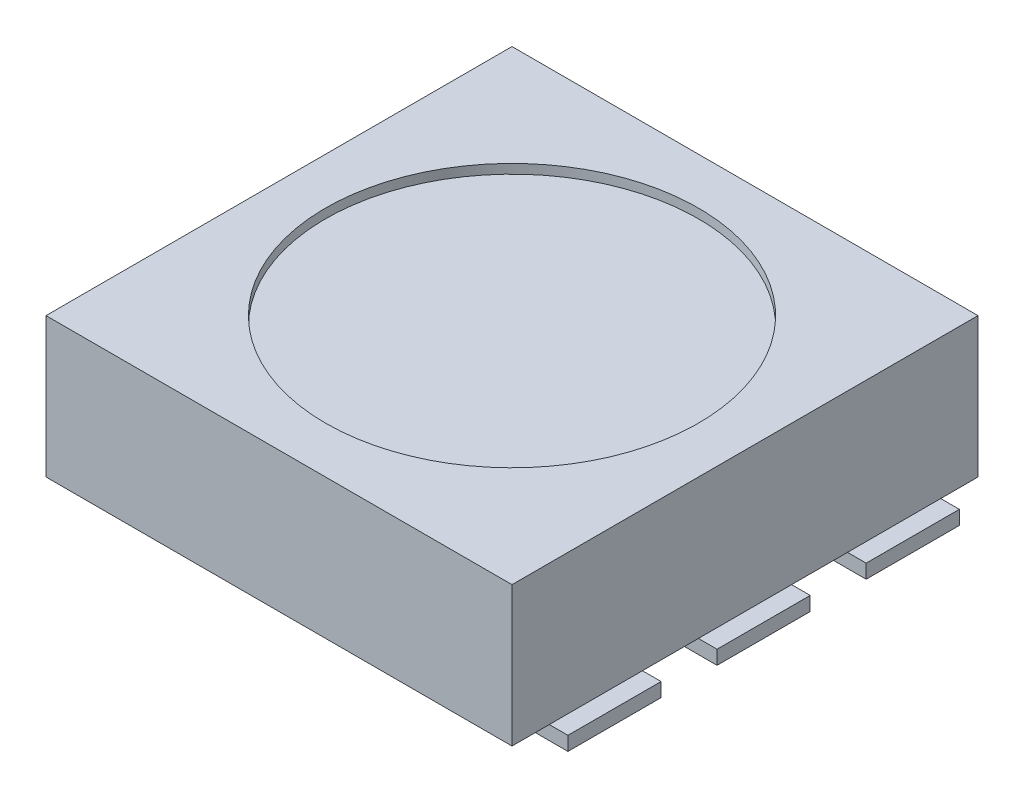
ISO-10303-21;
HEADER;
FILE_DESCRIPTION(('STEP AP214'),'2;1');
FILE_NAME('part.step','',(''),(''),'','','');
FILE_SCHEMA(('AUTOMOTIVE_DESIGN { 1 0 10303 214 1 1 1 1 }'));
ENDSEC;
DATA;
#1=APPLICATION_CONTEXT('core data for automotive mechanical design processes');
#2=APPLICATION_PROTOCOL_DEFINITION('international standard','automotive_design',2000,#1);
#3=PRODUCT_CONTEXT('',#1,'mechanical');
#4=PRODUCT('Part','Part','',(#3));
#5=PRODUCT_RELATED_PRODUCT_CATEGORY('part','',(#4));
#6=PRODUCT_DEFINITION_FORMATION('','',#4);
#7=PRODUCT_DEFINITION_CONTEXT('part definition',#1,'design');
#8=PRODUCT_DEFINITION('design','',#6,#7);
#9=PRODUCT_DEFINITION_SHAPE('','',#8);
#10=(LENGTH_UNIT() NAMED_UNIT(*) SI_UNIT(.MILLI.,.METRE.));
#11=(NAMED_UNIT(*) PLANE_ANGLE_UNIT() SI_UNIT($,.RADIAN.));
#12=(NAMED_UNIT(*) SI_UNIT($,.STERADIAN.) SOLID_ANGLE_UNIT());
#13=UNCERTAINTY_MEASURE_WITH_UNIT(LENGTH_MEASURE(1.E-05),#10,'distance_accuracy_value','');
#14=(GEOMETRIC_REPRESENTATION_CONTEXT(3) GLOBAL_UNCERTAINTY_ASSIGNED_CONTEXT((#13)) GLOBAL_UNIT_ASSIGNED_CONTEXT((#10,
#11,#12)) REPRESENTATION_CONTEXT('',''));
#15=CARTESIAN_POINT('',(0.,0.,0.));
#16=DIRECTION('',(0.,0.,1.));
#17=DIRECTION('',(1.,0.,0.));
#18=AXIS2_PLACEMENT_3D('',#15,#16,#17);
#19=CARTESIAN_POINT('',(-2.5,1.5,-2.5));
#20=DIRECTION('',(1.,0.,0.));
#21=DIRECTION('',(0.,0.,-1.));
#22=AXIS2_PLACEMENT_3D('',#19,#20,#21);
#23=PLANE('',#22);
#24=DIRECTION('',(0.,0.,1.));
#25=VECTOR('',#24,1.);
#26=CARTESIAN_POINT('',(-2.5,0.,-2.5));
#27=LINE('',#26,#25);
#28=CARTESIAN_POINT('',(-2.5,0.,-2.5));
#29=VERTEX_POINT('',#28);
#30=CARTESIAN_POINT('',(-2.5,0.,-2.1));
#31=VERTEX_POINT('',#30);
#32=EDGE_CURVE('E546',#29,#31,#27,.T.);
#33=ORIENTED_EDGE('',*,*,#32,.T.);
#34=CARTESIAN_POINT('',(-2.5,0.,-1.1));
#35=VERTEX_POINT('',#34);
#36=EDGE_CURVE('E551',#31,#35,#27,.T.);
#37=ORIENTED_EDGE('',*,*,#36,.T.);
#38=CARTESIAN_POINT('',(-2.5,0.,-0.5));
#39=VERTEX_POINT('',#38);
#40=EDGE_CURVE('E552',#35,#39,#27,.T.);
#41=ORIENTED_EDGE('',*,*,#40,.T.);
#42=CARTESIAN_POINT('',(-2.5,0.,0.5));
#43=VERTEX_POINT('',#42);
#44=EDGE_CURVE('E620',#39,#43,#27,.T.);
#45=ORIENTED_EDGE('',*,*,#44,.T.);
#46=CARTESIAN_POINT('',(-2.5,0.,1.1));
#47=VERTEX_POINT('',#46);
#48=EDGE_CURVE('E618',#43,#47,#27,.T.);
#49=ORIENTED_EDGE('',*,*,#48,.T.);
#50=CARTESIAN_POINT('',(-2.5,0.,2.1));
#51=VERTEX_POINT('',#50);
#52=EDGE_CURVE('E553',#47,#51,#27,.T.);
#53=ORIENTED_EDGE('',*,*,#52,.T.);
#54=CARTESIAN_POINT('',(-2.5,0.,2.5));
#55=VERTEX_POINT('',#54);
#56=EDGE_CURVE('E517',#51,#55,#27,.T.);
#57=ORIENTED_EDGE('',*,*,#56,.T.);
#58=DIRECTION('',(0.,-1.,0.));
#59=VECTOR('',#58,1.);
#60=CARTESIAN_POINT('',(-2.5,1.5,2.5));
#61=LINE('',#60,#59);
#62=CARTESIAN_POINT('',(-2.5,1.5,2.5));
#63=VERTEX_POINT('',#62);
#64=EDGE_CURVE('E576',#63,#55,#61,.T.);
#65=ORIENTED_EDGE('',*,*,#64,.F.);
#66=DIRECTION('',(0.,0.,1.));
#67=VECTOR('',#66,1.);
#68=CARTESIAN_POINT('',(-2.5,1.5,-2.5));
#69=LINE('',#68,#67);
#70=CARTESIAN_POINT('',(-2.5,1.5,-2.5));
#71=VERTEX_POINT('',#70);
#72=EDGE_CURVE('E529',#71,#63,#69,.T.);
#73=ORIENTED_EDGE('',*,*,#72,.F.);
#74=DIRECTION('',(0.,-1.,0.));
#75=VECTOR('',#74,1.);
#76=CARTESIAN_POINT('',(-2.5,1.5,-2.5));
#77=LINE('',#76,#75);
#78=EDGE_CURVE('E545',#71,#29,#77,.T.);
#79=ORIENTED_EDGE('',*,*,#78,.T.);
#80=EDGE_LOOP('',(#33,#37,#41,#45,#49,#53,#57,#65,#73,#79));
#81=FACE_BOUND('',#80,.T.);
#82=ADVANCED_FACE('F39',(#81),#23,.F.);
#83=CARTESIAN_POINT('',(-2.5,1.5,2.5));
#84=DIRECTION('',(0.,0.,-1.));
#85=DIRECTION('',(-1.,0.,0.));
#86=AXIS2_PLACEMENT_3D('',#83,#84,#85);
#87=PLANE('',#86);
#88=DIRECTION('',(1.,0.,0.));
#89=VECTOR('',#88,1.);
#90=CARTESIAN_POINT('',(-2.5,0.,2.5));
#91=LINE('',#90,#89);
#92=CARTESIAN_POINT('',(2.5,0.,2.5));
#93=VERTEX_POINT('',#92);
#94=EDGE_CURVE('E550',#55,#93,#91,.T.);
#95=ORIENTED_EDGE('',*,*,#94,.T.);
#96=DIRECTION('',(0.,-1.,0.));
#97=VECTOR('',#96,1.);
#98=CARTESIAN_POINT('',(2.5,1.5,2.5));
#99=LINE('',#98,#97);
#100=CARTESIAN_POINT('',(2.5,1.5,2.5));
#101=VERTEX_POINT('',#100);
#102=EDGE_CURVE('E572',#101,#93,#99,.T.);
#103=ORIENTED_EDGE('',*,*,#102,.F.);
#104=DIRECTION('',(1.,0.,0.));
#105=VECTOR('',#104,1.);
#106=CARTESIAN_POINT('',(-2.5,1.5,2.5));
#107=LINE('',#106,#105);
#108=EDGE_CURVE('E533',#63,#101,#107,.T.);
#109=ORIENTED_EDGE('',*,*,#108,.F.);
#110=ORIENTED_EDGE('',*,*,#64,.T.);
#111=EDGE_LOOP('',(#95,#103,#109,#110));
#112=FACE_BOUND('',#111,.T.);
#113=ADVANCED_FACE('F637',(#112),#87,.F.);
#114=CARTESIAN_POINT('',(2.5,1.5,-2.5));
#115=DIRECTION('',(1.,0.,0.));
#116=DIRECTION('',(0.,0.,-1.));
#117=AXIS2_PLACEMENT_3D('',#114,#115,#116);
#118=PLANE('',#117);
#119=DIRECTION('',(0.,0.,1.));
#120=VECTOR('',#119,1.);
#121=CARTESIAN_POINT('',(2.5,0.,-2.5));
#122=LINE('',#121,#120);
#123=CARTESIAN_POINT('',(2.5,0.,-2.5));
#124=VERTEX_POINT('',#123);
#125=CARTESIAN_POINT('',(2.5,0.,-2.1));
#126=VERTEX_POINT('',#125);
#127=EDGE_CURVE('E558',#124,#126,#122,.T.);
#128=ORIENTED_EDGE('',*,*,#127,.F.);
#129=DIRECTION('',(0.,-1.,0.));
#130=VECTOR('',#129,1.);
#131=CARTESIAN_POINT('',(2.5,1.5,-2.5));
#132=LINE('',#131,#130);
#133=CARTESIAN_POINT('',(2.5,1.5,-2.5));
#134=VERTEX_POINT('',#133);
#135=EDGE_CURVE('E569',#134,#124,#132,.T.);
#136=ORIENTED_EDGE('',*,*,#135,.F.);
#137=DIRECTION('',(0.,0.,1.));
#138=VECTOR('',#137,1.);
#139=CARTESIAN_POINT('',(2.5,1.5,-2.5));
#140=LINE('',#139,#138);
#141=EDGE_CURVE('E537',#134,#101,#140,.T.);
#142=ORIENTED_EDGE('',*,*,#141,.T.);
#143=ORIENTED_EDGE('',*,*,#102,.T.);
#144=CARTESIAN_POINT('',(2.5,0.,2.1));
#145=VERTEX_POINT('',#144);
#146=EDGE_CURVE('E557',#145,#93,#122,.T.);
#147=ORIENTED_EDGE('',*,*,#146,.F.);
#148=CARTESIAN_POINT('',(2.5,0.,1.1));
#149=VERTEX_POINT('',#148);
#150=EDGE_CURVE('E563',#149,#145,#122,.T.);
#151=ORIENTED_EDGE('',*,*,#150,.F.);
#152=CARTESIAN_POINT('',(2.5,0.,0.5));
#153=VERTEX_POINT('',#152);
#154=EDGE_CURVE('E652',#153,#149,#122,.T.);
#155=ORIENTED_EDGE('',*,*,#154,.F.);
#156=CARTESIAN_POINT('',(2.5,0.,-0.5));
#157=VERTEX_POINT('',#156);
#158=EDGE_CURVE('E654',#157,#153,#122,.T.);
#159=ORIENTED_EDGE('',*,*,#158,.F.);
#160=CARTESIAN_POINT('',(2.5,0.,-1.1));
#161=VERTEX_POINT('',#160);
#162=EDGE_CURVE('E562',#161,#157,#122,.T.);
#163=ORIENTED_EDGE('',*,*,#162,.F.);
#164=EDGE_CURVE('E561',#126,#161,#122,.T.);
#165=ORIENTED_EDGE('',*,*,#164,.F.);
#166=EDGE_LOOP('',(#128,#136,#142,#143,#147,#151,#155,#159,#163,#165));
#167=FACE_BOUND('',#166,.T.);
#168=ADVANCED_FACE('F648',(#167),#118,.T.);
#169=CARTESIAN_POINT('',(-2.5,1.5,-2.5));
#170=DIRECTION('',(0.,0.,-1.));
#171=DIRECTION('',(-1.,0.,0.));
#172=AXIS2_PLACEMENT_3D('',#169,#170,#171);
#173=PLANE('',#172);
#174=DIRECTION('',(1.,0.,0.));
#175=VECTOR('',#174,1.);
#176=CARTESIAN_POINT('',(-2.5,0.,-2.5));
#177=LINE('',#176,#175);
#178=EDGE_CURVE('E534',#29,#124,#177,.T.);
#179=ORIENTED_EDGE('',*,*,#178,.F.);
#180=ORIENTED_EDGE('',*,*,#78,.F.);
#181=DIRECTION('',(1.,0.,0.));
#182=VECTOR('',#181,1.);
#183=CARTESIAN_POINT('',(-2.5,1.5,-2.5));
#184=LINE('',#183,#182);
#185=EDGE_CURVE('E541',#71,#134,#184,.T.);
#186=ORIENTED_EDGE('',*,*,#185,.T.);
#187=ORIENTED_EDGE('',*,*,#135,.T.);
#188=EDGE_LOOP('',(#179,#180,#186,#187));
#189=FACE_BOUND('',#188,.T.);
#190=ADVANCED_FACE('F644',(#189),#173,.T.);
#191=CARTESIAN_POINT('',(0.,1.5,0.));
#192=DIRECTION('',(0.,1.,0.));
#193=DIRECTION('',(0.,0.,1.));
#194=AXIS2_PLACEMENT_3D('',#191,#192,#193);
#195=PLANE('',#194);
#196=CARTESIAN_POINT('',(0.,1.5,0.));
#197=DIRECTION('',(0.,1.,0.));
#198=DIRECTION('',(0.,0.,1.));
#199=AXIS2_PLACEMENT_3D('',#196,#197,#198);
#200=CIRCLE('',#199,2.);
#201=CARTESIAN_POINT('',(0.,1.5,2.));
#202=VERTEX_POINT('',#201);
#203=EDGE_CURVE('E706',#202,#202,#200,.T.);
#204=ORIENTED_EDGE('',*,*,#203,.F.);
#205=EDGE_LOOP('',(#204));
#206=FACE_BOUND('',#205,.T.);
#207=ORIENTED_EDGE('',*,*,#72,.T.);
#208=ORIENTED_EDGE('',*,*,#108,.T.);
#209=ORIENTED_EDGE('',*,*,#141,.F.);
#210=ORIENTED_EDGE('',*,*,#185,.F.);
#211=EDGE_LOOP('',(#207,#208,#209,#210));
#212=FACE_BOUND('',#211,.T.);
#213=ADVANCED_FACE('F641',(#206,#212),#195,.T.);
#214=CARTESIAN_POINT('',(0.,0.,0.));
#215=DIRECTION('',(0.,1.,0.));
#216=DIRECTION('',(0.,0.,1.));
#217=AXIS2_PLACEMENT_3D('',#214,#215,#216);
#218=PLANE('',#217);
#219=DIRECTION('',(0.,0.,-1.));
#220=VECTOR('',#219,1.);
#221=CARTESIAN_POINT('',(1.7,0.,-1.1));
#222=LINE('',#221,#220);
#223=CARTESIAN_POINT('',(1.7,0.,-1.1));
#224=VERTEX_POINT('',#223);
#225=CARTESIAN_POINT('',(1.7,0.,-2.1));
#226=VERTEX_POINT('',#225);
#227=EDGE_CURVE('E54',#224,#226,#222,.T.);
#228=ORIENTED_EDGE('',*,*,#227,.F.);
#229=DIRECTION('',(1.,0.,0.));
#230=VECTOR('',#229,1.);
#231=CARTESIAN_POINT('',(1.7,0.,-1.1));
#232=LINE('',#231,#230);
#233=EDGE_CURVE('E288',#224,#161,#232,.T.);
#234=ORIENTED_EDGE('',*,*,#233,.T.);
#235=ORIENTED_EDGE('',*,*,#162,.T.);
#236=DIRECTION('',(1.,0.,0.));
#237=VECTOR('',#236,1.);
#238=CARTESIAN_POINT('',(1.7,0.,-0.5));
#239=LINE('',#238,#237);
#240=CARTESIAN_POINT('',(1.7,0.,-0.5));
#241=VERTEX_POINT('',#240);
#242=EDGE_CURVE('E328',#241,#157,#239,.T.);
#243=ORIENTED_EDGE('',*,*,#242,.F.);
#244=DIRECTION('',(0.,0.,-1.));
#245=VECTOR('',#244,1.);
#246=CARTESIAN_POINT('',(1.7,0.,0.5));
#247=LINE('',#246,#245);
#248=CARTESIAN_POINT('',(1.7,0.,0.5));
#249=VERTEX_POINT('',#248);
#250=EDGE_CURVE('E322',#249,#241,#247,.T.);
#251=ORIENTED_EDGE('',*,*,#250,.F.);
#252=DIRECTION('',(1.,0.,0.));
#253=VECTOR('',#252,1.);
#254=CARTESIAN_POINT('',(1.7,0.,0.5));
#255=LINE('',#254,#253);
#256=EDGE_CURVE('E337',#249,#153,#255,.T.);
#257=ORIENTED_EDGE('',*,*,#256,.T.);
#258=ORIENTED_EDGE('',*,*,#154,.T.);
#259=DIRECTION('',(1.,0.,0.));
#260=VECTOR('',#259,1.);
#261=CARTESIAN_POINT('',(1.7,0.,1.1));
#262=LINE('',#261,#260);
#263=CARTESIAN_POINT('',(1.7,0.,1.1));
#264=VERTEX_POINT('',#263);
#265=EDGE_CURVE('E375',#264,#149,#262,.T.);
#266=ORIENTED_EDGE('',*,*,#265,.F.);
#267=DIRECTION('',(0.,0.,-1.));
#268=VECTOR('',#267,1.);
#269=CARTESIAN_POINT('',(1.7,0.,2.1));
#270=LINE('',#269,#268);
#271=CARTESIAN_POINT('',(1.7,0.,2.1));
#272=VERTEX_POINT('',#271);
#273=EDGE_CURVE('E369',#272,#264,#270,.T.);
#274=ORIENTED_EDGE('',*,*,#273,.F.);
#275=DIRECTION('',(1.,0.,0.));
#276=VECTOR('',#275,1.);
#277=CARTESIAN_POINT('',(1.7,0.,2.1));
#278=LINE('',#277,#276);
#279=EDGE_CURVE('E384',#272,#145,#278,.T.);
#280=ORIENTED_EDGE('',*,*,#279,.T.);
#281=ORIENTED_EDGE('',*,*,#146,.T.);
#282=ORIENTED_EDGE('',*,*,#94,.F.);
#283=ORIENTED_EDGE('',*,*,#56,.F.);
#284=DIRECTION('',(1.,0.,0.));
#285=VECTOR('',#284,1.);
#286=CARTESIAN_POINT('',(-2.7,0.,2.1));
#287=LINE('',#286,#285);
#288=CARTESIAN_POINT('',(-1.7,0.,2.1));
#289=VERTEX_POINT('',#288);
#290=EDGE_CURVE('E504',#51,#289,#287,.T.);
#291=ORIENTED_EDGE('',*,*,#290,.T.);
#292=DIRECTION('',(0.,0.,-1.));
#293=VECTOR('',#292,1.);
#294=CARTESIAN_POINT('',(-1.7,0.,2.1));
#295=LINE('',#294,#293);
#296=CARTESIAN_POINT('',(-1.7,0.,1.1));
#297=VERTEX_POINT('',#296);
#298=EDGE_CURVE('E503',#289,#297,#295,.T.);
#299=ORIENTED_EDGE('',*,*,#298,.T.);
#300=DIRECTION('',(1.,0.,0.));
#301=VECTOR('',#300,1.);
#302=CARTESIAN_POINT('',(-2.7,0.,1.1));
#303=LINE('',#302,#301);
#304=EDGE_CURVE('E511',#47,#297,#303,.T.);
#305=ORIENTED_EDGE('',*,*,#304,.F.);
#306=ORIENTED_EDGE('',*,*,#48,.F.);
#307=DIRECTION('',(1.,0.,0.));
#308=VECTOR('',#307,1.);
#309=CARTESIAN_POINT('',(0.,0.,0.5));
#310=LINE('',#309,#308);
#311=CARTESIAN_POINT('',(-1.7,0.,0.5));
#312=VERTEX_POINT('',#311);
#313=EDGE_CURVE('E584',#43,#312,#310,.T.);
#314=ORIENTED_EDGE('',*,*,#313,.T.);
#315=DIRECTION('',(0.,0.,-1.));
#316=VECTOR('',#315,1.);
#317=CARTESIAN_POINT('',(-1.7,0.,0.5));
#318=LINE('',#317,#316);
#319=CARTESIAN_POINT('',(-1.7,0.,-0.5));
#320=VERTEX_POINT('',#319);
#321=EDGE_CURVE('E463',#312,#320,#318,.T.);
#322=ORIENTED_EDGE('',*,*,#321,.T.);
#323=DIRECTION('',(1.,0.,0.));
#324=VECTOR('',#323,1.);
#325=CARTESIAN_POINT('',(0.,0.,-0.5));
#326=LINE('',#325,#324);
#327=EDGE_CURVE('E580',#39,#320,#326,.T.);
#328=ORIENTED_EDGE('',*,*,#327,.F.);
#329=ORIENTED_EDGE('',*,*,#40,.F.);
#330=DIRECTION('',(1.,0.,0.));
#331=VECTOR('',#330,1.);
#332=CARTESIAN_POINT('',(0.,0.,-1.1));
#333=LINE('',#332,#331);
#334=CARTESIAN_POINT('',(-1.7,0.,-1.1));
#335=VERTEX_POINT('',#334);
#336=EDGE_CURVE('E11',#35,#335,#333,.T.);
#337=ORIENTED_EDGE('',*,*,#336,.T.);
#338=DIRECTION('',(0.,0.,-1.));
#339=VECTOR('',#338,1.);
#340=CARTESIAN_POINT('',(-1.7,0.,-1.1));
#341=LINE('',#340,#339);
#342=CARTESIAN_POINT('',(-1.7,0.,-2.1));
#343=VERTEX_POINT('',#342);
#344=EDGE_CURVE('E421',#335,#343,#341,.T.);
#345=ORIENTED_EDGE('',*,*,#344,.T.);
#346=DIRECTION('',(1.,0.,0.));
#347=VECTOR('',#346,1.);
#348=CARTESIAN_POINT('',(0.,0.,-2.1));
#349=LINE('',#348,#347);
#350=EDGE_CURVE('E47',#31,#343,#349,.T.);
#351=ORIENTED_EDGE('',*,*,#350,.F.);
#352=ORIENTED_EDGE('',*,*,#32,.F.);
#353=ORIENTED_EDGE('',*,*,#178,.T.);
#354=ORIENTED_EDGE('',*,*,#127,.T.);
#355=DIRECTION('',(1.,0.,0.));
#356=VECTOR('',#355,1.);
#357=CARTESIAN_POINT('',(1.7,0.,-2.1));
#358=LINE('',#357,#356);
#359=EDGE_CURVE('E59',#226,#126,#358,.T.);
#360=ORIENTED_EDGE('',*,*,#359,.F.);
#361=EDGE_LOOP('',(#228,#234,#235,#243,#251,#257,#258,#266,#274,#280,#281,#282,#283,#291,#299,
#305,#306,#314,#322,#328,#329,#337,#345,#351,#352,#353,#354,#360));
#362=FACE_BOUND('',#361,.T.);
#363=ADVANCED_FACE('F597',(#362),#218,.F.);
#364=CARTESIAN_POINT('',(0.,0.,0.));
#365=DIRECTION('',(0.,1.,0.));
#366=DIRECTION('',(0.,0.,1.));
#367=AXIS2_PLACEMENT_3D('',#364,#365,#366);
#368=PLANE('',#367);
#369=ORIENTED_EDGE('',*,*,#52,.F.);
#370=CARTESIAN_POINT('',(-2.7,0.,1.1));
#371=VERTEX_POINT('',#370);
#372=EDGE_CURVE('E507',#371,#47,#303,.T.);
#373=ORIENTED_EDGE('',*,*,#372,.F.);
#374=DIRECTION('',(0.,0.,-1.));
#375=VECTOR('',#374,1.);
#376=CARTESIAN_POINT('',(-2.7,0.,2.1));
#377=LINE('',#376,#375);
#378=CARTESIAN_POINT('',(-2.7,0.,2.1));
#379=VERTEX_POINT('',#378);
#380=EDGE_CURVE('E489',#379,#371,#377,.T.);
#381=ORIENTED_EDGE('',*,*,#380,.F.);
#382=EDGE_CURVE('E471',#379,#51,#287,.T.);
#383=ORIENTED_EDGE('',*,*,#382,.T.);
#384=EDGE_LOOP('',(#369,#373,#381,#383));
#385=FACE_BOUND('',#384,.T.);
#386=ADVANCED_FACE('F742',(#385),#368,.T.);
#387=CARTESIAN_POINT('',(-2.7,-0.15,2.1));
#388=DIRECTION('',(0.,0.,1.));
#389=DIRECTION('',(1.,0.,0.));
#390=AXIS2_PLACEMENT_3D('',#387,#388,#389);
#391=PLANE('',#390);
#392=ORIENTED_EDGE('',*,*,#382,.F.);
#393=DIRECTION('',(0.,1.,0.));
#394=VECTOR('',#393,1.);
#395=CARTESIAN_POINT('',(-2.7,-0.15,2.1));
#396=LINE('',#395,#394);
#397=CARTESIAN_POINT('',(-2.7,-0.15,2.1));
#398=VERTEX_POINT('',#397);
#399=EDGE_CURVE('E514',#398,#379,#396,.T.);
#400=ORIENTED_EDGE('',*,*,#399,.F.);
#401=DIRECTION('',(1.,0.,0.));
#402=VECTOR('',#401,1.);
#403=CARTESIAN_POINT('',(-2.7,-0.15,2.1));
#404=LINE('',#403,#402);
#405=CARTESIAN_POINT('',(-1.7,-0.15,2.1));
#406=VERTEX_POINT('',#405);
#407=EDGE_CURVE('E484',#398,#406,#404,.T.);
#408=ORIENTED_EDGE('',*,*,#407,.T.);
#409=DIRECTION('',(0.,1.,0.));
#410=VECTOR('',#409,1.);
#411=CARTESIAN_POINT('',(-1.7,-0.15,2.1));
#412=LINE('',#411,#410);
#413=EDGE_CURVE('E499',#406,#289,#412,.T.);
#414=ORIENTED_EDGE('',*,*,#413,.T.);
#415=ORIENTED_EDGE('',*,*,#290,.F.);
#416=EDGE_LOOP('',(#392,#400,#408,#414,#415));
#417=FACE_BOUND('',#416,.T.);
#418=ADVANCED_FACE('F746',(#417),#391,.T.);
#419=CARTESIAN_POINT('',(-2.7,-0.15,2.1));
#420=DIRECTION('',(1.,0.,0.));
#421=DIRECTION('',(0.,0.,-1.));
#422=AXIS2_PLACEMENT_3D('',#419,#420,#421);
#423=PLANE('',#422);
#424=ORIENTED_EDGE('',*,*,#380,.T.);
#425=DIRECTION('',(0.,1.,0.));
#426=VECTOR('',#425,1.);
#427=CARTESIAN_POINT('',(-2.7,-0.15,1.1));
#428=LINE('',#427,#426);
#429=CARTESIAN_POINT('',(-2.7,-0.15,1.1));
#430=VERTEX_POINT('',#429);
#431=EDGE_CURVE('E518',#430,#371,#428,.T.);
#432=ORIENTED_EDGE('',*,*,#431,.F.);
#433=DIRECTION('',(0.,0.,-1.));
#434=VECTOR('',#433,1.);
#435=CARTESIAN_POINT('',(-2.7,-0.15,2.1));
#436=LINE('',#435,#434);
#437=EDGE_CURVE('E496',#398,#430,#436,.T.);
#438=ORIENTED_EDGE('',*,*,#437,.F.);
#439=ORIENTED_EDGE('',*,*,#399,.T.);
#440=EDGE_LOOP('',(#424,#432,#438,#439));
#441=FACE_BOUND('',#440,.T.);
#442=ADVANCED_FACE('F749',(#441),#423,.F.);
#443=CARTESIAN_POINT('',(-2.7,-0.15,1.1));
#444=DIRECTION('',(0.,0.,1.));
#445=DIRECTION('',(1.,0.,0.));
#446=AXIS2_PLACEMENT_3D('',#443,#444,#445);
#447=PLANE('',#446);
#448=ORIENTED_EDGE('',*,*,#372,.T.);
#449=ORIENTED_EDGE('',*,*,#304,.T.);
#450=DIRECTION('',(0.,1.,0.));
#451=VECTOR('',#450,1.);
#452=CARTESIAN_POINT('',(-1.7,-0.15,1.1));
#453=LINE('',#452,#451);
#454=CARTESIAN_POINT('',(-1.7,-0.15,1.1));
#455=VERTEX_POINT('',#454);
#456=EDGE_CURVE('E522',#455,#297,#453,.T.);
#457=ORIENTED_EDGE('',*,*,#456,.F.);
#458=DIRECTION('',(1.,0.,0.));
#459=VECTOR('',#458,1.);
#460=CARTESIAN_POINT('',(-2.7,-0.15,1.1));
#461=LINE('',#460,#459);
#462=EDGE_CURVE('E493',#430,#455,#461,.T.);
#463=ORIENTED_EDGE('',*,*,#462,.F.);
#464=ORIENTED_EDGE('',*,*,#431,.T.);
#465=EDGE_LOOP('',(#448,#449,#457,#463,#464));
#466=FACE_BOUND('',#465,.T.);
#467=ADVANCED_FACE('F755',(#466),#447,.F.);
#468=CARTESIAN_POINT('',(-1.7,-0.15,2.1));
#469=DIRECTION('',(1.,0.,0.));
#470=DIRECTION('',(0.,0.,-1.));
#471=AXIS2_PLACEMENT_3D('',#468,#469,#470);
#472=PLANE('',#471);
#473=ORIENTED_EDGE('',*,*,#298,.F.);
#474=ORIENTED_EDGE('',*,*,#413,.F.);
#475=DIRECTION('',(0.,0.,-1.));
#476=VECTOR('',#475,1.);
#477=CARTESIAN_POINT('',(-1.7,-0.15,2.1));
#478=LINE('',#477,#476);
#479=EDGE_CURVE('E488',#406,#455,#478,.T.);
#480=ORIENTED_EDGE('',*,*,#479,.T.);
#481=ORIENTED_EDGE('',*,*,#456,.T.);
#482=EDGE_LOOP('',(#473,#474,#480,#481));
#483=FACE_BOUND('',#482,.T.);
#484=ADVANCED_FACE('F751',(#483),#472,.T.);
#485=CARTESIAN_POINT('',(0.,-0.15,0.));
#486=DIRECTION('',(0.,1.,0.));
#487=DIRECTION('',(0.,0.,1.));
#488=AXIS2_PLACEMENT_3D('',#485,#486,#487);
#489=PLANE('',#488);
#490=ORIENTED_EDGE('',*,*,#407,.F.);
#491=ORIENTED_EDGE('',*,*,#437,.T.);
#492=ORIENTED_EDGE('',*,*,#462,.T.);
#493=ORIENTED_EDGE('',*,*,#479,.F.);
#494=EDGE_LOOP('',(#490,#491,#492,#493));
#495=FACE_BOUND('',#494,.T.);
#496=ADVANCED_FACE('F754',(#495),#489,.F.);
#497=CARTESIAN_POINT('',(0.,0.,0.));
#498=DIRECTION('',(0.,1.,0.));
#499=DIRECTION('',(0.,0.,1.));
#500=AXIS2_PLACEMENT_3D('',#497,#498,#499);
#501=PLANE('',#500);
#502=ORIENTED_EDGE('',*,*,#44,.F.);
#503=DIRECTION('',(1.,0.,0.));
#504=VECTOR('',#503,1.);
#505=CARTESIAN_POINT('',(-2.7,0.,-0.5));
#506=LINE('',#505,#504);
#507=CARTESIAN_POINT('',(-2.7,0.,-0.5));
#508=VERTEX_POINT('',#507);
#509=EDGE_CURVE('E458',#508,#39,#506,.T.);
#510=ORIENTED_EDGE('',*,*,#509,.F.);
#511=DIRECTION('',(0.,0.,-1.));
#512=VECTOR('',#511,1.);
#513=CARTESIAN_POINT('',(-2.7,0.,0.5));
#514=LINE('',#513,#512);
#515=CARTESIAN_POINT('',(-2.7,0.,0.5));
#516=VERTEX_POINT('',#515);
#517=EDGE_CURVE('E455',#516,#508,#514,.T.);
#518=ORIENTED_EDGE('',*,*,#517,.F.);
#519=DIRECTION('',(1.,0.,0.));
#520=VECTOR('',#519,1.);
#521=CARTESIAN_POINT('',(-2.7,0.,0.5));
#522=LINE('',#521,#520);
#523=EDGE_CURVE('E467',#516,#43,#522,.T.);
#524=ORIENTED_EDGE('',*,*,#523,.T.);
#525=EDGE_LOOP('',(#502,#510,#518,#524));
#526=FACE_BOUND('',#525,.T.);
#527=ADVANCED_FACE('F768',(#526),#501,.T.);
#528=CARTESIAN_POINT('',(-2.7,-0.15,0.5));
#529=DIRECTION('',(0.,0.,1.));
#530=DIRECTION('',(1.,0.,0.));
#531=AXIS2_PLACEMENT_3D('',#528,#529,#530);
#532=PLANE('',#531);
#533=ORIENTED_EDGE('',*,*,#523,.F.);
#534=DIRECTION('',(0.,1.,0.));
#535=VECTOR('',#534,1.);
#536=CARTESIAN_POINT('',(-2.7,-0.15,0.5));
#537=LINE('',#536,#535);
#538=CARTESIAN_POINT('',(-2.7,-0.15,0.5));
#539=VERTEX_POINT('',#538);
#540=EDGE_CURVE('E429',#539,#516,#537,.T.);
#541=ORIENTED_EDGE('',*,*,#540,.F.);
#542=DIRECTION('',(1.,0.,0.));
#543=VECTOR('',#542,1.);
#544=CARTESIAN_POINT('',(-2.7,-0.15,0.5));
#545=LINE('',#544,#543);
#546=CARTESIAN_POINT('',(-1.7,-0.15,0.5));
#547=VERTEX_POINT('',#546);
#548=EDGE_CURVE('E459',#539,#547,#545,.T.);
#549=ORIENTED_EDGE('',*,*,#548,.T.);
#550=DIRECTION('',(0.,1.,0.));
#551=VECTOR('',#550,1.);
#552=CARTESIAN_POINT('',(-1.7,-0.15,0.5));
#553=LINE('',#552,#551);
#554=EDGE_CURVE('E442',#547,#312,#553,.T.);
#555=ORIENTED_EDGE('',*,*,#554,.T.);
#556=ORIENTED_EDGE('',*,*,#313,.F.);
#557=EDGE_LOOP('',(#533,#541,#549,#555,#556));
#558=FACE_BOUND('',#557,.T.);
#559=ADVANCED_FACE('F777',(#558),#532,.T.);
#560=CARTESIAN_POINT('',(-2.7,-0.15,0.5));
#561=DIRECTION('',(1.,0.,0.));
#562=DIRECTION('',(0.,0.,-1.));
#563=AXIS2_PLACEMENT_3D('',#560,#561,#562);
#564=PLANE('',#563);
#565=ORIENTED_EDGE('',*,*,#517,.T.);
#566=DIRECTION('',(0.,1.,0.));
#567=VECTOR('',#566,1.);
#568=CARTESIAN_POINT('',(-2.7,-0.15,-0.5));
#569=LINE('',#568,#567);
#570=CARTESIAN_POINT('',(-2.7,-0.15,-0.5));
#571=VERTEX_POINT('',#570);
#572=EDGE_CURVE('E449',#571,#508,#569,.T.);
#573=ORIENTED_EDGE('',*,*,#572,.F.);
#574=DIRECTION('',(0.,0.,-1.));
#575=VECTOR('',#574,1.);
#576=CARTESIAN_POINT('',(-2.7,-0.15,0.5));
#577=LINE('',#576,#575);
#578=EDGE_CURVE('E445',#539,#571,#577,.T.);
#579=ORIENTED_EDGE('',*,*,#578,.F.);
#580=ORIENTED_EDGE('',*,*,#540,.T.);
#581=EDGE_LOOP('',(#565,#573,#579,#580));
#582=FACE_BOUND('',#581,.T.);
#583=ADVANCED_FACE('F779',(#582),#564,.F.);
#584=CARTESIAN_POINT('',(-2.7,-0.15,-0.5));
#585=DIRECTION('',(0.,0.,1.));
#586=DIRECTION('',(1.,0.,0.));
#587=AXIS2_PLACEMENT_3D('',#584,#585,#586);
#588=PLANE('',#587);
#589=ORIENTED_EDGE('',*,*,#509,.T.);
#590=ORIENTED_EDGE('',*,*,#327,.T.);
#591=DIRECTION('',(0.,1.,0.));
#592=VECTOR('',#591,1.);
#593=CARTESIAN_POINT('',(-1.7,-0.15,-0.5));
#594=LINE('',#593,#592);
#595=CARTESIAN_POINT('',(-1.7,-0.15,-0.5));
#596=VERTEX_POINT('',#595);
#597=EDGE_CURVE('E446',#596,#320,#594,.T.);
#598=ORIENTED_EDGE('',*,*,#597,.F.);
#599=DIRECTION('',(1.,0.,0.));
#600=VECTOR('',#599,1.);
#601=CARTESIAN_POINT('',(-2.7,-0.15,-0.5));
#602=LINE('',#601,#600);
#603=EDGE_CURVE('E474',#571,#596,#602,.T.);
#604=ORIENTED_EDGE('',*,*,#603,.F.);
#605=ORIENTED_EDGE('',*,*,#572,.T.);
#606=EDGE_LOOP('',(#589,#590,#598,#604,#605));
#607=FACE_BOUND('',#606,.T.);
#608=ADVANCED_FACE('F782',(#607),#588,.F.);
#609=CARTESIAN_POINT('',(-1.7,-0.15,0.5));
#610=DIRECTION('',(1.,0.,0.));
#611=DIRECTION('',(0.,0.,-1.));
#612=AXIS2_PLACEMENT_3D('',#609,#610,#611);
#613=PLANE('',#612);
#614=ORIENTED_EDGE('',*,*,#321,.F.);
#615=ORIENTED_EDGE('',*,*,#554,.F.);
#616=DIRECTION('',(0.,0.,-1.));
#617=VECTOR('',#616,1.);
#618=CARTESIAN_POINT('',(-1.7,-0.15,0.5));
#619=LINE('',#618,#617);
#620=EDGE_CURVE('E477',#547,#596,#619,.T.);
#621=ORIENTED_EDGE('',*,*,#620,.T.);
#622=ORIENTED_EDGE('',*,*,#597,.T.);
#623=EDGE_LOOP('',(#614,#615,#621,#622));
#624=FACE_BOUND('',#623,.T.);
#625=ADVANCED_FACE('F773',(#624),#613,.T.);
#626=CARTESIAN_POINT('',(0.,-0.15,0.));
#627=DIRECTION('',(0.,1.,0.));
#628=DIRECTION('',(0.,0.,1.));
#629=AXIS2_PLACEMENT_3D('',#626,#627,#628);
#630=PLANE('',#629);
#631=ORIENTED_EDGE('',*,*,#548,.F.);
#632=ORIENTED_EDGE('',*,*,#578,.T.);
#633=ORIENTED_EDGE('',*,*,#603,.T.);
#634=ORIENTED_EDGE('',*,*,#620,.F.);
#635=EDGE_LOOP('',(#631,#632,#633,#634));
#636=FACE_BOUND('',#635,.T.);
#637=ADVANCED_FACE('F770',(#636),#630,.F.);
#638=CARTESIAN_POINT('',(0.,0.,0.));
#639=DIRECTION('',(0.,1.,0.));
#640=DIRECTION('',(0.,0.,1.));
#641=AXIS2_PLACEMENT_3D('',#638,#639,#640);
#642=PLANE('',#641);
#643=ORIENTED_EDGE('',*,*,#36,.F.);
#644=DIRECTION('',(1.,0.,0.));
#645=VECTOR('',#644,1.);
#646=CARTESIAN_POINT('',(-2.7,0.,-2.1));
#647=LINE('',#646,#645);
#648=CARTESIAN_POINT('',(-2.7,0.,-2.1));
#649=VERTEX_POINT('',#648);
#650=EDGE_CURVE('E416',#649,#31,#647,.T.);
#651=ORIENTED_EDGE('',*,*,#650,.F.);
#652=DIRECTION('',(0.,0.,-1.));
#653=VECTOR('',#652,1.);
#654=CARTESIAN_POINT('',(-2.7,0.,-1.1));
#655=LINE('',#654,#653);
#656=CARTESIAN_POINT('',(-2.7,0.,-1.1));
#657=VERTEX_POINT('',#656);
#658=EDGE_CURVE('E413',#657,#649,#655,.T.);
#659=ORIENTED_EDGE('',*,*,#658,.F.);
#660=DIRECTION('',(1.,0.,0.));
#661=VECTOR('',#660,1.);
#662=CARTESIAN_POINT('',(-2.7,0.,-1.1));
#663=LINE('',#662,#661);
#664=EDGE_CURVE('E425',#657,#35,#663,.T.);
#665=ORIENTED_EDGE('',*,*,#664,.T.);
#666=EDGE_LOOP('',(#643,#651,#659,#665));
#667=FACE_BOUND('',#666,.T.);
#668=ADVANCED_FACE('F614',(#667),#642,.T.);
#669=CARTESIAN_POINT('',(-2.7,-0.15,-1.1));
#670=DIRECTION('',(0.,0.,1.));
#671=DIRECTION('',(1.,0.,0.));
#672=AXIS2_PLACEMENT_3D('',#669,#670,#671);
#673=PLANE('',#672);
#674=ORIENTED_EDGE('',*,*,#664,.F.);
#675=DIRECTION('',(0.,1.,0.));
#676=VECTOR('',#675,1.);
#677=CARTESIAN_POINT('',(-2.7,-0.15,-1.1));
#678=LINE('',#677,#676);
#679=CARTESIAN_POINT('',(-2.7,-0.15,-1.1));
#680=VERTEX_POINT('',#679);
#681=EDGE_CURVE('E387',#680,#657,#678,.T.);
#682=ORIENTED_EDGE('',*,*,#681,.F.);
#683=DIRECTION('',(1.,0.,0.));
#684=VECTOR('',#683,1.);
#685=CARTESIAN_POINT('',(-2.7,-0.15,-1.1));
#686=LINE('',#685,#684);
#687=CARTESIAN_POINT('',(-1.7,-0.15,-1.1));
#688=VERTEX_POINT('',#687);
#689=EDGE_CURVE('E417',#680,#688,#686,.T.);
#690=ORIENTED_EDGE('',*,*,#689,.T.);
#691=DIRECTION('',(0.,1.,0.));
#692=VECTOR('',#691,1.);
#693=CARTESIAN_POINT('',(-1.7,-0.15,-1.1));
#694=LINE('',#693,#692);
#695=EDGE_CURVE('E400',#688,#335,#694,.T.);
#696=ORIENTED_EDGE('',*,*,#695,.T.);
#697=ORIENTED_EDGE('',*,*,#336,.F.);
#698=EDGE_LOOP('',(#674,#682,#690,#696,#697));
#699=FACE_BOUND('',#698,.T.);
#700=ADVANCED_FACE('F607',(#699),#673,.T.);
#701=CARTESIAN_POINT('',(-2.7,-0.15,-1.1));
#702=DIRECTION('',(1.,0.,0.));
#703=DIRECTION('',(0.,0.,-1.));
#704=AXIS2_PLACEMENT_3D('',#701,#702,#703);
#705=PLANE('',#704);
#706=ORIENTED_EDGE('',*,*,#658,.T.);
#707=DIRECTION('',(0.,1.,0.));
#708=VECTOR('',#707,1.);
#709=CARTESIAN_POINT('',(-2.7,-0.15,-2.1));
#710=LINE('',#709,#708);
#711=CARTESIAN_POINT('',(-2.7,-0.15,-2.1));
#712=VERTEX_POINT('',#711);
#713=EDGE_CURVE('E407',#712,#649,#710,.T.);
#714=ORIENTED_EDGE('',*,*,#713,.F.);
#715=DIRECTION('',(0.,0.,-1.));
#716=VECTOR('',#715,1.);
#717=CARTESIAN_POINT('',(-2.7,-0.15,-1.1));
#718=LINE('',#717,#716);
#719=EDGE_CURVE('E403',#680,#712,#718,.T.);
#720=ORIENTED_EDGE('',*,*,#719,.F.);
#721=ORIENTED_EDGE('',*,*,#681,.T.);
#722=EDGE_LOOP('',(#706,#714,#720,#721));
#723=FACE_BOUND('',#722,.T.);
#724=ADVANCED_FACE('F612',(#723),#705,.F.);
#725=CARTESIAN_POINT('',(-2.7,-0.15,-2.1));
#726=DIRECTION('',(0.,0.,1.));
#727=DIRECTION('',(1.,0.,0.));
#728=AXIS2_PLACEMENT_3D('',#725,#726,#727);
#729=PLANE('',#728);
#730=ORIENTED_EDGE('',*,*,#650,.T.);
#731=ORIENTED_EDGE('',*,*,#350,.T.);
#732=DIRECTION('',(0.,1.,0.));
#733=VECTOR('',#732,1.);
#734=CARTESIAN_POINT('',(-1.7,-0.15,-2.1));
#735=LINE('',#734,#733);
#736=CARTESIAN_POINT('',(-1.7,-0.15,-2.1));
#737=VERTEX_POINT('',#736);
#738=EDGE_CURVE('E404',#737,#343,#735,.T.);
#739=ORIENTED_EDGE('',*,*,#738,.F.);
#740=DIRECTION('',(1.,0.,0.));
#741=VECTOR('',#740,1.);
#742=CARTESIAN_POINT('',(-2.7,-0.15,-2.1));
#743=LINE('',#742,#741);
#744=EDGE_CURVE('E432',#712,#737,#743,.T.);
#745=ORIENTED_EDGE('',*,*,#744,.F.);
#746=ORIENTED_EDGE('',*,*,#713,.T.);
#747=EDGE_LOOP('',(#730,#731,#739,#745,#746));
#748=FACE_BOUND('',#747,.T.);
#749=ADVANCED_FACE('F592',(#748),#729,.F.);
#750=CARTESIAN_POINT('',(-1.7,-0.15,-1.1));
#751=DIRECTION('',(1.,0.,0.));
#752=DIRECTION('',(0.,0.,-1.));
#753=AXIS2_PLACEMENT_3D('',#750,#751,#752);
#754=PLANE('',#753);
#755=ORIENTED_EDGE('',*,*,#344,.F.);
#756=ORIENTED_EDGE('',*,*,#695,.F.);
#757=DIRECTION('',(0.,0.,-1.));
#758=VECTOR('',#757,1.);
#759=CARTESIAN_POINT('',(-1.7,-0.15,-1.1));
#760=LINE('',#759,#758);
#761=EDGE_CURVE('E435',#688,#737,#760,.T.);
#762=ORIENTED_EDGE('',*,*,#761,.T.);
#763=ORIENTED_EDGE('',*,*,#738,.T.);
#764=EDGE_LOOP('',(#755,#756,#762,#763));
#765=FACE_BOUND('',#764,.T.);
#766=ADVANCED_FACE('F600',(#765),#754,.T.);
#767=CARTESIAN_POINT('',(0.,-0.15,0.));
#768=DIRECTION('',(0.,1.,0.));
#769=DIRECTION('',(0.,0.,1.));
#770=AXIS2_PLACEMENT_3D('',#767,#768,#769);
#771=PLANE('',#770);
#772=ORIENTED_EDGE('',*,*,#689,.F.);
#773=ORIENTED_EDGE('',*,*,#719,.T.);
#774=ORIENTED_EDGE('',*,*,#744,.T.);
#775=ORIENTED_EDGE('',*,*,#761,.F.);
#776=EDGE_LOOP('',(#772,#773,#774,#775));
#777=FACE_BOUND('',#776,.T.);
#778=ADVANCED_FACE('F604',(#777),#771,.F.);
#779=CARTESIAN_POINT('',(1.7,-0.15,2.1));
#780=DIRECTION('',(0.,0.,1.));
#781=DIRECTION('',(1.,0.,0.));
#782=AXIS2_PLACEMENT_3D('',#779,#780,#781);
#783=PLANE('',#782);
#784=ORIENTED_EDGE('',*,*,#279,.F.);
#785=DIRECTION('',(0.,1.,0.));
#786=VECTOR('',#785,1.);
#787=CARTESIAN_POINT('',(1.7,-0.15,2.1));
#788=LINE('',#787,#786);
#789=CARTESIAN_POINT('',(1.7,-0.15,2.1));
#790=VERTEX_POINT('',#789);
#791=EDGE_CURVE('E340',#790,#272,#788,.T.);
#792=ORIENTED_EDGE('',*,*,#791,.F.);
#793=DIRECTION('',(1.,0.,0.));
#794=VECTOR('',#793,1.);
#795=CARTESIAN_POINT('',(1.7,-0.15,2.1));
#796=LINE('',#795,#794);
#797=CARTESIAN_POINT('',(2.7,-0.15,2.1));
#798=VERTEX_POINT('',#797);
#799=EDGE_CURVE('E374',#790,#798,#796,.T.);
#800=ORIENTED_EDGE('',*,*,#799,.T.);
#801=DIRECTION('',(0.,1.,0.));
#802=VECTOR('',#801,1.);
#803=CARTESIAN_POINT('',(2.7,-0.15,2.1));
#804=LINE('',#803,#802);
#805=CARTESIAN_POINT('',(2.7,0.,2.1));
#806=VERTEX_POINT('',#805);
#807=EDGE_CURVE('E353',#798,#806,#804,.T.);
#808=ORIENTED_EDGE('',*,*,#807,.T.);
#809=EDGE_CURVE('E383',#145,#806,#278,.T.);
#810=ORIENTED_EDGE('',*,*,#809,.F.);
#811=EDGE_LOOP('',(#784,#792,#800,#808,#810));
#812=FACE_BOUND('',#811,.T.);
#813=ADVANCED_FACE('F669',(#812),#783,.T.);
#814=CARTESIAN_POINT('',(1.7,-0.15,2.1));
#815=DIRECTION('',(1.,0.,0.));
#816=DIRECTION('',(0.,0.,-1.));
#817=AXIS2_PLACEMENT_3D('',#814,#815,#816);
#818=PLANE('',#817);
#819=ORIENTED_EDGE('',*,*,#273,.T.);
#820=DIRECTION('',(0.,1.,0.));
#821=VECTOR('',#820,1.);
#822=CARTESIAN_POINT('',(1.7,-0.15,1.1));
#823=LINE('',#822,#821);
#824=CARTESIAN_POINT('',(1.7,-0.15,1.1));
#825=VERTEX_POINT('',#824);
#826=EDGE_CURVE('E362',#825,#264,#823,.T.);
#827=ORIENTED_EDGE('',*,*,#826,.F.);
#828=DIRECTION('',(0.,0.,-1.));
#829=VECTOR('',#828,1.);
#830=CARTESIAN_POINT('',(1.7,-0.15,2.1));
#831=LINE('',#830,#829);
#832=EDGE_CURVE('E357',#790,#825,#831,.T.);
#833=ORIENTED_EDGE('',*,*,#832,.F.);
#834=ORIENTED_EDGE('',*,*,#791,.T.);
#835=EDGE_LOOP('',(#819,#827,#833,#834));
#836=FACE_BOUND('',#835,.T.);
#837=ADVANCED_FACE('F812',(#836),#818,.F.);
#838=CARTESIAN_POINT('',(1.7,-0.15,1.1));
#839=DIRECTION('',(0.,0.,1.));
#840=DIRECTION('',(1.,0.,0.));
#841=AXIS2_PLACEMENT_3D('',#838,#839,#840);
#842=PLANE('',#841);
#843=ORIENTED_EDGE('',*,*,#265,.T.);
#844=CARTESIAN_POINT('',(2.7,0.,1.1));
#845=VERTEX_POINT('',#844);
#846=EDGE_CURVE('E373',#149,#845,#262,.T.);
#847=ORIENTED_EDGE('',*,*,#846,.T.);
#848=DIRECTION('',(0.,1.,0.));
#849=VECTOR('',#848,1.);
#850=CARTESIAN_POINT('',(2.7,-0.15,1.1));
#851=LINE('',#850,#849);
#852=CARTESIAN_POINT('',(2.7,-0.15,1.1));
#853=VERTEX_POINT('',#852);
#854=EDGE_CURVE('E358',#853,#845,#851,.T.);
#855=ORIENTED_EDGE('',*,*,#854,.F.);
#856=DIRECTION('',(1.,0.,0.));
#857=VECTOR('',#856,1.);
#858=CARTESIAN_POINT('',(1.7,-0.15,1.1));
#859=LINE('',#858,#857);
#860=EDGE_CURVE('E390',#825,#853,#859,.T.);
#861=ORIENTED_EDGE('',*,*,#860,.F.);
#862=ORIENTED_EDGE('',*,*,#826,.T.);
#863=EDGE_LOOP('',(#843,#847,#855,#861,#862));
#864=FACE_BOUND('',#863,.T.);
#865=ADVANCED_FACE('F815',(#864),#842,.F.);
#866=CARTESIAN_POINT('',(2.7,-0.15,2.1));
#867=DIRECTION('',(1.,0.,0.));
#868=DIRECTION('',(0.,0.,-1.));
#869=AXIS2_PLACEMENT_3D('',#866,#867,#868);
#870=PLANE('',#869);
#871=DIRECTION('',(0.,0.,-1.));
#872=VECTOR('',#871,1.);
#873=CARTESIAN_POINT('',(2.7,0.,2.1));
#874=LINE('',#873,#872);
#875=EDGE_CURVE('E379',#806,#845,#874,.T.);
#876=ORIENTED_EDGE('',*,*,#875,.F.);
#877=ORIENTED_EDGE('',*,*,#807,.F.);
#878=DIRECTION('',(0.,0.,-1.));
#879=VECTOR('',#878,1.);
#880=CARTESIAN_POINT('',(2.7,-0.15,2.1));
#881=LINE('',#880,#879);
#882=EDGE_CURVE('E393',#798,#853,#881,.T.);
#883=ORIENTED_EDGE('',*,*,#882,.T.);
#884=ORIENTED_EDGE('',*,*,#854,.T.);
#885=EDGE_LOOP('',(#876,#877,#883,#884));
#886=FACE_BOUND('',#885,.T.);
#887=ADVANCED_FACE('F808',(#886),#870,.T.);
#888=CARTESIAN_POINT('',(0.,-0.15,0.));
#889=DIRECTION('',(0.,1.,0.));
#890=DIRECTION('',(0.,0.,1.));
#891=AXIS2_PLACEMENT_3D('',#888,#889,#890);
#892=PLANE('',#891);
#893=ORIENTED_EDGE('',*,*,#799,.F.);
#894=ORIENTED_EDGE('',*,*,#832,.T.);
#895=ORIENTED_EDGE('',*,*,#860,.T.);
#896=ORIENTED_EDGE('',*,*,#882,.F.);
#897=EDGE_LOOP('',(#893,#894,#895,#896));
#898=FACE_BOUND('',#897,.T.);
#899=ADVANCED_FACE('F805',(#898),#892,.F.);
#900=CARTESIAN_POINT('',(0.,0.,0.));
#901=DIRECTION('',(0.,1.,0.));
#902=DIRECTION('',(0.,0.,1.));
#903=AXIS2_PLACEMENT_3D('',#900,#901,#902);
#904=PLANE('',#903);
#905=ORIENTED_EDGE('',*,*,#846,.F.);
#906=ORIENTED_EDGE('',*,*,#150,.T.);
#907=ORIENTED_EDGE('',*,*,#809,.T.);
#908=ORIENTED_EDGE('',*,*,#875,.T.);
#909=EDGE_LOOP('',(#905,#906,#907,#908));
#910=FACE_BOUND('',#909,.T.);
#911=ADVANCED_FACE('F666',(#910),#904,.T.);
#912=CARTESIAN_POINT('',(1.7,-0.15,0.5));
#913=DIRECTION('',(0.,0.,1.));
#914=DIRECTION('',(1.,0.,0.));
#915=AXIS2_PLACEMENT_3D('',#912,#913,#914);
#916=PLANE('',#915);
#917=ORIENTED_EDGE('',*,*,#256,.F.);
#918=DIRECTION('',(0.,1.,0.));
#919=VECTOR('',#918,1.);
#920=CARTESIAN_POINT('',(1.7,-0.15,0.5));
#921=LINE('',#920,#919);
#922=CARTESIAN_POINT('',(1.7,-0.15,0.5));
#923=VERTEX_POINT('',#922);
#924=EDGE_CURVE('E293',#923,#249,#921,.T.);
#925=ORIENTED_EDGE('',*,*,#924,.F.);
#926=DIRECTION('',(1.,0.,0.));
#927=VECTOR('',#926,1.);
#928=CARTESIAN_POINT('',(1.7,-0.15,0.5));
#929=LINE('',#928,#927);
#930=CARTESIAN_POINT('',(2.7,-0.15,0.5));
#931=VERTEX_POINT('',#930);
#932=EDGE_CURVE('E327',#923,#931,#929,.T.);
#933=ORIENTED_EDGE('',*,*,#932,.T.);
#934=DIRECTION('',(0.,1.,0.));
#935=VECTOR('',#934,1.);
#936=CARTESIAN_POINT('',(2.7,-0.15,0.5));
#937=LINE('',#936,#935);
#938=CARTESIAN_POINT('',(2.7,0.,0.5));
#939=VERTEX_POINT('',#938);
#940=EDGE_CURVE('E306',#931,#939,#937,.T.);
#941=ORIENTED_EDGE('',*,*,#940,.T.);
#942=EDGE_CURVE('E336',#153,#939,#255,.T.);
#943=ORIENTED_EDGE('',*,*,#942,.F.);
#944=EDGE_LOOP('',(#917,#925,#933,#941,#943));
#945=FACE_BOUND('',#944,.T.);
#946=ADVANCED_FACE('F689',(#945),#916,.T.);
#947=CARTESIAN_POINT('',(1.7,-0.15,0.5));
#948=DIRECTION('',(1.,0.,0.));
#949=DIRECTION('',(0.,0.,-1.));
#950=AXIS2_PLACEMENT_3D('',#947,#948,#949);
#951=PLANE('',#950);
#952=ORIENTED_EDGE('',*,*,#250,.T.);
#953=DIRECTION('',(0.,1.,0.));
#954=VECTOR('',#953,1.);
#955=CARTESIAN_POINT('',(1.7,-0.15,-0.5));
#956=LINE('',#955,#954);
#957=CARTESIAN_POINT('',(1.7,-0.15,-0.5));
#958=VERTEX_POINT('',#957);
#959=EDGE_CURVE('E315',#958,#241,#956,.T.);
#960=ORIENTED_EDGE('',*,*,#959,.F.);
#961=DIRECTION('',(0.,0.,-1.));
#962=VECTOR('',#961,1.);
#963=CARTESIAN_POINT('',(1.7,-0.15,0.5));
#964=LINE('',#963,#962);
#965=EDGE_CURVE('E310',#923,#958,#964,.T.);
#966=ORIENTED_EDGE('',*,*,#965,.F.);
#967=ORIENTED_EDGE('',*,*,#924,.T.);
#968=EDGE_LOOP('',(#952,#960,#966,#967));
#969=FACE_BOUND('',#968,.T.);
#970=ADVANCED_FACE('F696',(#969),#951,.F.);
#971=CARTESIAN_POINT('',(1.7,-0.15,-0.5));
#972=DIRECTION('',(0.,0.,1.));
#973=DIRECTION('',(1.,0.,0.));
#974=AXIS2_PLACEMENT_3D('',#971,#972,#973);
#975=PLANE('',#974);
#976=ORIENTED_EDGE('',*,*,#242,.T.);
#977=CARTESIAN_POINT('',(2.7,0.,-0.5));
#978=VERTEX_POINT('',#977);
#979=EDGE_CURVE('E326',#157,#978,#239,.T.);
#980=ORIENTED_EDGE('',*,*,#979,.T.);
#981=DIRECTION('',(0.,1.,0.));
#982=VECTOR('',#981,1.);
#983=CARTESIAN_POINT('',(2.7,-0.15,-0.5));
#984=LINE('',#983,#982);
#985=CARTESIAN_POINT('',(2.7,-0.15,-0.5));
#986=VERTEX_POINT('',#985);
#987=EDGE_CURVE('E311',#986,#978,#984,.T.);
#988=ORIENTED_EDGE('',*,*,#987,.F.);
#989=DIRECTION('',(1.,0.,0.));
#990=VECTOR('',#989,1.);
#991=CARTESIAN_POINT('',(1.7,-0.15,-0.5));
#992=LINE('',#991,#990);
#993=EDGE_CURVE('E343',#958,#986,#992,.T.);
#994=ORIENTED_EDGE('',*,*,#993,.F.);
#995=ORIENTED_EDGE('',*,*,#959,.T.);
#996=EDGE_LOOP('',(#976,#980,#988,#994,#995));
#997=FACE_BOUND('',#996,.T.);
#998=ADVANCED_FACE('F678',(#997),#975,.F.);
#999=CARTESIAN_POINT('',(2.7,-0.15,0.5));
#1000=DIRECTION('',(1.,0.,0.));
#1001=DIRECTION('',(0.,0.,-1.));
#1002=AXIS2_PLACEMENT_3D('',#999,#1000,#1001);
#1003=PLANE('',#1002);
#1004=DIRECTION('',(0.,0.,-1.));
#1005=VECTOR('',#1004,1.);
#1006=CARTESIAN_POINT('',(2.7,0.,0.5));
#1007=LINE('',#1006,#1005);
#1008=EDGE_CURVE('E332',#939,#978,#1007,.T.);
#1009=ORIENTED_EDGE('',*,*,#1008,.F.);
#1010=ORIENTED_EDGE('',*,*,#940,.F.);
#1011=DIRECTION('',(0.,0.,-1.));
#1012=VECTOR('',#1011,1.);
#1013=CARTESIAN_POINT('',(2.7,-0.15,0.5));
#1014=LINE('',#1013,#1012);
#1015=EDGE_CURVE('E346',#931,#986,#1014,.T.);
#1016=ORIENTED_EDGE('',*,*,#1015,.T.);
#1017=ORIENTED_EDGE('',*,*,#987,.T.);
#1018=EDGE_LOOP('',(#1009,#1010,#1016,#1017));
#1019=FACE_BOUND('',#1018,.T.);
#1020=ADVANCED_FACE('F683',(#1019),#1003,.T.);
#1021=CARTESIAN_POINT('',(0.,-0.15,0.));
#1022=DIRECTION('',(0.,1.,0.));
#1023=DIRECTION('',(0.,0.,1.));
#1024=AXIS2_PLACEMENT_3D('',#1021,#1022,#1023);
#1025=PLANE('',#1024);
#1026=ORIENTED_EDGE('',*,*,#932,.F.);
#1027=ORIENTED_EDGE('',*,*,#965,.T.);
#1028=ORIENTED_EDGE('',*,*,#993,.T.);
#1029=ORIENTED_EDGE('',*,*,#1015,.F.);
#1030=EDGE_LOOP('',(#1026,#1027,#1028,#1029));
#1031=FACE_BOUND('',#1030,.T.);
#1032=ADVANCED_FACE('F692',(#1031),#1025,.F.);
#1033=CARTESIAN_POINT('',(0.,0.,0.));
#1034=DIRECTION('',(0.,1.,0.));
#1035=DIRECTION('',(0.,0.,1.));
#1036=AXIS2_PLACEMENT_3D('',#1033,#1034,#1035);
#1037=PLANE('',#1036);
#1038=ORIENTED_EDGE('',*,*,#979,.F.);
#1039=ORIENTED_EDGE('',*,*,#158,.T.);
#1040=ORIENTED_EDGE('',*,*,#942,.T.);
#1041=ORIENTED_EDGE('',*,*,#1008,.T.);
#1042=EDGE_LOOP('',(#1038,#1039,#1040,#1041));
#1043=FACE_BOUND('',#1042,.T.);
#1044=ADVANCED_FACE('F685',(#1043),#1037,.T.);
#1045=CARTESIAN_POINT('',(1.7,-0.15,-1.1));
#1046=DIRECTION('',(0.,0.,1.));
#1047=DIRECTION('',(1.,0.,0.));
#1048=AXIS2_PLACEMENT_3D('',#1045,#1046,#1047);
#1049=PLANE('',#1048);
#1050=ORIENTED_EDGE('',*,*,#233,.F.);
#1051=DIRECTION('',(0.,1.,0.));
#1052=VECTOR('',#1051,1.);
#1053=CARTESIAN_POINT('',(1.7,-0.15,-1.1));
#1054=LINE('',#1053,#1052);
#1055=CARTESIAN_POINT('',(1.7,-0.15,-1.1));
#1056=VERTEX_POINT('',#1055);
#1057=EDGE_CURVE('E700',#1056,#224,#1054,.T.);
#1058=ORIENTED_EDGE('',*,*,#1057,.F.);
#1059=DIRECTION('',(1.,0.,0.));
#1060=VECTOR('',#1059,1.);
#1061=CARTESIAN_POINT('',(1.7,-0.15,-1.1));
#1062=LINE('',#1061,#1060);
#1063=CARTESIAN_POINT('',(2.7,-0.15,-1.1));
#1064=VERTEX_POINT('',#1063);
#1065=EDGE_CURVE('E302',#1056,#1064,#1062,.T.);
#1066=ORIENTED_EDGE('',*,*,#1065,.T.);
#1067=DIRECTION('',(0.,1.,0.));
#1068=VECTOR('',#1067,1.);
#1069=CARTESIAN_POINT('',(2.7,-0.15,-1.1));
#1070=LINE('',#1069,#1068);
#1071=CARTESIAN_POINT('',(2.7,0.,-1.1));
#1072=VERTEX_POINT('',#1071);
#1073=EDGE_CURVE('E277',#1064,#1072,#1070,.T.);
#1074=ORIENTED_EDGE('',*,*,#1073,.T.);
#1075=EDGE_CURVE('E282',#161,#1072,#232,.T.);
#1076=ORIENTED_EDGE('',*,*,#1075,.F.);
#1077=EDGE_LOOP('',(#1050,#1058,#1066,#1074,#1076));
#1078=FACE_BOUND('',#1077,.T.);
#1079=ADVANCED_FACE('F699',(#1078),#1049,.T.);
#1080=CARTESIAN_POINT('',(1.7,-0.15,-1.1));
#1081=DIRECTION('',(1.,0.,0.));
#1082=DIRECTION('',(0.,0.,-1.));
#1083=AXIS2_PLACEMENT_3D('',#1080,#1081,#1082);
#1084=PLANE('',#1083);
#1085=ORIENTED_EDGE('',*,*,#227,.T.);
#1086=DIRECTION('',(0.,1.,0.));
#1087=VECTOR('',#1086,1.);
#1088=CARTESIAN_POINT('',(1.7,-0.15,-2.1));
#1089=LINE('',#1088,#1087);
#1090=CARTESIAN_POINT('',(1.7,-0.15,-2.1));
#1091=VERTEX_POINT('',#1090);
#1092=EDGE_CURVE('E278',#1091,#226,#1089,.T.);
#1093=ORIENTED_EDGE('',*,*,#1092,.F.);
#1094=DIRECTION('',(0.,0.,-1.));
#1095=VECTOR('',#1094,1.);
#1096=CARTESIAN_POINT('',(1.7,-0.15,-1.1));
#1097=LINE('',#1096,#1095);
#1098=EDGE_CURVE('E294',#1056,#1091,#1097,.T.);
#1099=ORIENTED_EDGE('',*,*,#1098,.F.);
#1100=ORIENTED_EDGE('',*,*,#1057,.T.);
#1101=EDGE_LOOP('',(#1085,#1093,#1099,#1100));
#1102=FACE_BOUND('',#1101,.T.);
#1103=ADVANCED_FACE('F716',(#1102),#1084,.F.);
#1104=CARTESIAN_POINT('',(1.7,-0.15,-2.1));
#1105=DIRECTION('',(0.,0.,1.));
#1106=DIRECTION('',(1.,0.,0.));
#1107=AXIS2_PLACEMENT_3D('',#1104,#1105,#1106);
#1108=PLANE('',#1107);
#1109=ORIENTED_EDGE('',*,*,#359,.T.);
#1110=CARTESIAN_POINT('',(2.7,0.,-2.1));
#1111=VERTEX_POINT('',#1110);
#1112=EDGE_CURVE('E258',#126,#1111,#358,.T.);
#1113=ORIENTED_EDGE('',*,*,#1112,.T.);
#1114=DIRECTION('',(0.,1.,0.));
#1115=VECTOR('',#1114,1.);
#1116=CARTESIAN_POINT('',(2.7,-0.15,-2.1));
#1117=LINE('',#1116,#1115);
#1118=CARTESIAN_POINT('',(2.7,-0.15,-2.1));
#1119=VERTEX_POINT('',#1118);
#1120=EDGE_CURVE('E262',#1119,#1111,#1117,.T.);
#1121=ORIENTED_EDGE('',*,*,#1120,.F.);
#1122=DIRECTION('',(1.,0.,0.));
#1123=VECTOR('',#1122,1.);
#1124=CARTESIAN_POINT('',(1.7,-0.15,-2.1));
#1125=LINE('',#1124,#1123);
#1126=EDGE_CURVE('E297',#1091,#1119,#1125,.T.);
#1127=ORIENTED_EDGE('',*,*,#1126,.F.);
#1128=ORIENTED_EDGE('',*,*,#1092,.T.);
#1129=EDGE_LOOP('',(#1109,#1113,#1121,#1127,#1128));
#1130=FACE_BOUND('',#1129,.T.);
#1131=ADVANCED_FACE('F260',(#1130),#1108,.F.);
#1132=CARTESIAN_POINT('',(2.7,-0.15,-1.1));
#1133=DIRECTION('',(1.,0.,0.));
#1134=DIRECTION('',(0.,0.,-1.));
#1135=AXIS2_PLACEMENT_3D('',#1132,#1133,#1134);
#1136=PLANE('',#1135);
#1137=DIRECTION('',(0.,0.,-1.));
#1138=VECTOR('',#1137,1.);
#1139=CARTESIAN_POINT('',(2.7,0.,-1.1));
#1140=LINE('',#1139,#1138);
#1141=EDGE_CURVE('E273',#1072,#1111,#1140,.T.);
#1142=ORIENTED_EDGE('',*,*,#1141,.F.);
#1143=ORIENTED_EDGE('',*,*,#1073,.F.);
#1144=DIRECTION('',(0.,0.,-1.));
#1145=VECTOR('',#1144,1.);
#1146=CARTESIAN_POINT('',(2.7,-0.15,-1.1));
#1147=LINE('',#1146,#1145);
#1148=EDGE_CURVE('E275',#1064,#1119,#1147,.T.);
#1149=ORIENTED_EDGE('',*,*,#1148,.T.);
#1150=ORIENTED_EDGE('',*,*,#1120,.T.);
#1151=EDGE_LOOP('',(#1142,#1143,#1149,#1150));
#1152=FACE_BOUND('',#1151,.T.);
#1153=ADVANCED_FACE('F272',(#1152),#1136,.T.);
#1154=CARTESIAN_POINT('',(0.,-0.15,0.));
#1155=DIRECTION('',(0.,1.,0.));
#1156=DIRECTION('',(0.,0.,1.));
#1157=AXIS2_PLACEMENT_3D('',#1154,#1155,#1156);
#1158=PLANE('',#1157);
#1159=ORIENTED_EDGE('',*,*,#1065,.F.);
#1160=ORIENTED_EDGE('',*,*,#1098,.T.);
#1161=ORIENTED_EDGE('',*,*,#1126,.T.);
#1162=ORIENTED_EDGE('',*,*,#1148,.F.);
#1163=EDGE_LOOP('',(#1159,#1160,#1161,#1162));
#1164=FACE_BOUND('',#1163,.T.);
#1165=ADVANCED_FACE('F718',(#1164),#1158,.F.);
#1166=CARTESIAN_POINT('',(0.,0.,0.));
#1167=DIRECTION('',(0.,1.,0.));
#1168=DIRECTION('',(0.,0.,1.));
#1169=AXIS2_PLACEMENT_3D('',#1166,#1167,#1168);
#1170=PLANE('',#1169);
#1171=ORIENTED_EDGE('',*,*,#1112,.F.);
#1172=ORIENTED_EDGE('',*,*,#164,.T.);
#1173=ORIENTED_EDGE('',*,*,#1075,.T.);
#1174=ORIENTED_EDGE('',*,*,#1141,.T.);
#1175=EDGE_LOOP('',(#1171,#1172,#1173,#1174));
#1176=FACE_BOUND('',#1175,.T.);
#1177=ADVANCED_FACE('F280',(#1176),#1170,.T.);
#1178=CARTESIAN_POINT('',(0.,1.4,0.));
#1179=DIRECTION('',(0.,1.,0.));
#1180=DIRECTION('',(0.,0.,1.));
#1181=AXIS2_PLACEMENT_3D('',#1178,#1179,#1180);
#1182=CYLINDRICAL_SURFACE('',#1181,2.);
#1183=CARTESIAN_POINT('',(0.,1.4,0.));
#1184=DIRECTION('',(0.,1.,0.));
#1185=DIRECTION('',(0.,0.,1.));
#1186=AXIS2_PLACEMENT_3D('',#1183,#1184,#1185);
#1187=CIRCLE('',#1186,2.);
#1188=CARTESIAN_POINT('',(0.,1.4,2.));
#1189=VERTEX_POINT('',#1188);
#1190=EDGE_CURVE('E712',#1189,#1189,#1187,.T.);
#1191=ORIENTED_EDGE('',*,*,#1190,.F.);
#1192=EDGE_LOOP('',(#1191));
#1193=FACE_BOUND('',#1192,.T.);
#1194=ORIENTED_EDGE('',*,*,#203,.T.);
#1195=EDGE_LOOP('',(#1194));
#1196=FACE_BOUND('',#1195,.T.);
#1197=ADVANCED_FACE('F725',(#1193,#1196),#1182,.F.);
#1198=CARTESIAN_POINT('',(0.,1.4,0.));
#1199=DIRECTION('',(0.,1.,0.));
#1200=DIRECTION('',(0.,0.,1.));
#1201=AXIS2_PLACEMENT_3D('',#1198,#1199,#1200);
#1202=PLANE('',#1201);
#1203=ORIENTED_EDGE('',*,*,#1190,.T.);
#1204=EDGE_LOOP('',(#1203));
#1205=FACE_BOUND('',#1204,.T.);
#1206=ADVANCED_FACE('F908',(#1205),#1202,.T.);
#1207=CLOSED_SHELL('',(#82,#113,#168,#190,#213,#363,#386,#418,#442,#467,#484,#496,#527,#559,
#583,#608,#625,#637,#668,#700,#724,#749,#766,#778,#813,#837,#865,#887,#899,#911,#946,#970,#998,
#1020,#1032,#1044,#1079,#1103,#1131,#1153,#1165,#1177,#1197,#1206));
#1208=MANIFOLD_SOLID_BREP('B2',#1207);
#1209=ADVANCED_BREP_SHAPE_REPRESENTATION('',(#18,#1208),#14);
#1210=SHAPE_DEFINITION_REPRESENTATION(#9,#1209);
ENDSEC;
END-ISO-10303-21;
